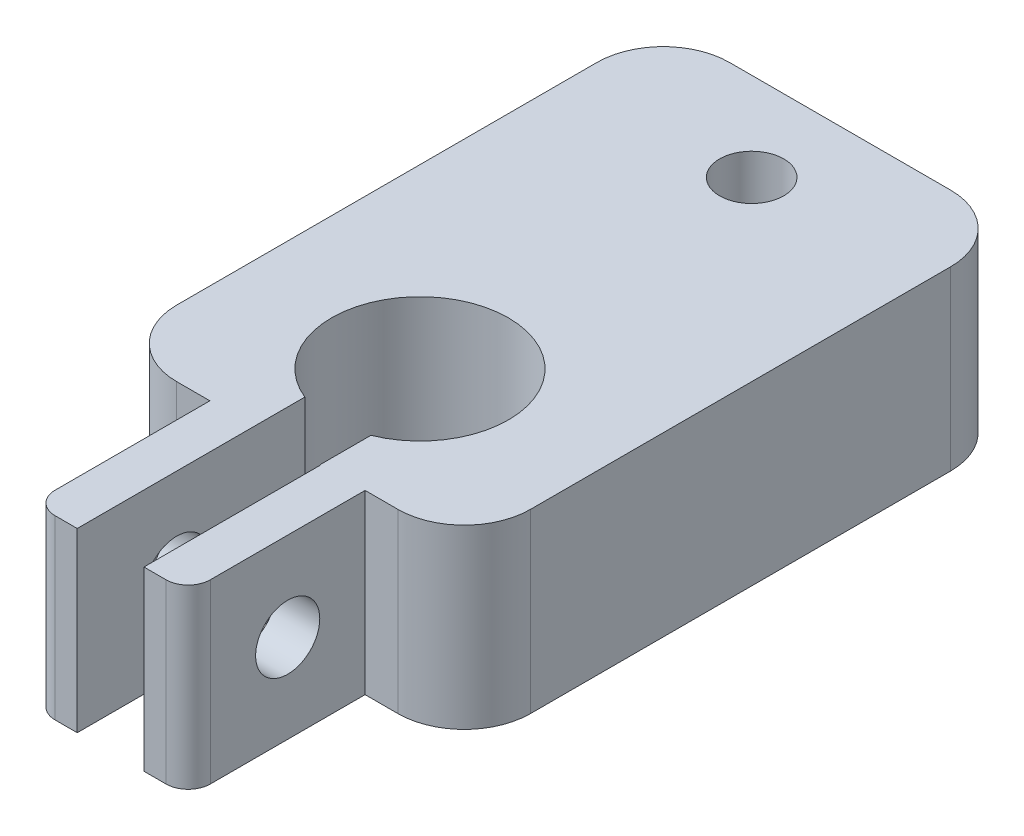
ISO-10303-21;
HEADER;
FILE_DESCRIPTION(('STEP AP214'),'2;1');
FILE_NAME('part.step','',(''),(''),'','','');
FILE_SCHEMA(('AUTOMOTIVE_DESIGN { 1 0 10303 214 1 1 1 1 }'));
ENDSEC;
DATA;
#1=APPLICATION_CONTEXT('core data for automotive mechanical design processes');
#2=APPLICATION_PROTOCOL_DEFINITION('international standard','automotive_design',2000,#1);
#3=PRODUCT_CONTEXT('',#1,'mechanical');
#4=PRODUCT('Part','Part','',(#3));
#5=PRODUCT_RELATED_PRODUCT_CATEGORY('part','',(#4));
#6=PRODUCT_DEFINITION_FORMATION('','',#4);
#7=PRODUCT_DEFINITION_CONTEXT('part definition',#1,'design');
#8=PRODUCT_DEFINITION('design','',#6,#7);
#9=PRODUCT_DEFINITION_SHAPE('','',#8);
#10=(LENGTH_UNIT() NAMED_UNIT(*) SI_UNIT(.MILLI.,.METRE.));
#11=(NAMED_UNIT(*) PLANE_ANGLE_UNIT() SI_UNIT($,.RADIAN.));
#12=(NAMED_UNIT(*) SI_UNIT($,.STERADIAN.) SOLID_ANGLE_UNIT());
#13=UNCERTAINTY_MEASURE_WITH_UNIT(LENGTH_MEASURE(1.E-05),#10,'distance_accuracy_value','');
#14=(GEOMETRIC_REPRESENTATION_CONTEXT(3) GLOBAL_UNCERTAINTY_ASSIGNED_CONTEXT((#13)) GLOBAL_UNIT_ASSIGNED_CONTEXT((#10,
#11,#12)) REPRESENTATION_CONTEXT('',''));
#15=CARTESIAN_POINT('',(0.,0.,0.));
#16=DIRECTION('',(0.,0.,1.));
#17=DIRECTION('',(1.,0.,0.));
#18=AXIS2_PLACEMENT_3D('',#15,#16,#17);
#19=CARTESIAN_POINT('',(0.,8.,0.));
#20=DIRECTION('',(0.,0.,-1.));
#21=DIRECTION('',(-1.,0.,0.));
#22=AXIS2_PLACEMENT_3D('',#19,#20,#21);
#23=PLANE('',#22);
#24=DIRECTION('',(1.,0.,0.));
#25=VECTOR('',#24,1.);
#26=CARTESIAN_POINT('',(0.,8.,0.));
#27=LINE('',#26,#25);
#28=CARTESIAN_POINT('',(9.49362775564579,8.,0.));
#29=VERTEX_POINT('',#28);
#30=CARTESIAN_POINT('',(9.51830255498302,8.,0.));
#31=VERTEX_POINT('',#30);
#32=EDGE_CURVE('E220',#29,#31,#27,.T.);
#33=ORIENTED_EDGE('',*,*,#32,.F.);
#34=DIRECTION('',(0.,-1.,0.));
#35=VECTOR('',#34,1.);
#36=CARTESIAN_POINT('',(9.49362775564579,8.,0.));
#37=LINE('',#36,#35);
#38=CARTESIAN_POINT('',(9.49362775564579,0.,0.));
#39=VERTEX_POINT('',#38);
#40=EDGE_CURVE('E182',#29,#39,#37,.T.);
#41=ORIENTED_EDGE('',*,*,#40,.T.);
#42=DIRECTION('',(1.,0.,0.));
#43=VECTOR('',#42,1.);
#44=CARTESIAN_POINT('',(0.,0.,0.));
#45=LINE('',#44,#43);
#46=CARTESIAN_POINT('',(9.51830255498302,0.,0.));
#47=VERTEX_POINT('',#46);
#48=EDGE_CURVE('E192',#39,#47,#45,.T.);
#49=ORIENTED_EDGE('',*,*,#48,.T.);
#50=DIRECTION('',(0.,1.,0.));
#51=VECTOR('',#50,1.);
#52=CARTESIAN_POINT('',(9.51830255498302,0.,0.));
#53=LINE('',#52,#51);
#54=EDGE_CURVE('E196',#47,#31,#53,.T.);
#55=ORIENTED_EDGE('',*,*,#54,.T.);
#56=EDGE_LOOP('',(#33,#41,#49,#55));
#57=FACE_BOUND('',#56,.T.);
#58=ADVANCED_FACE('F37',(#57),#23,.F.);
#59=CARTESIAN_POINT('',(3.,0.,0.));
#60=VERTEX_POINT('',#59);
#61=CARTESIAN_POINT('',(4.5,0.,0.));
#62=VERTEX_POINT('',#61);
#63=EDGE_CURVE('E230',#60,#62,#45,.T.);
#64=ORIENTED_EDGE('',*,*,#63,.T.);
#65=DIRECTION('',(0.,1.,0.));
#66=VECTOR('',#65,1.);
#67=CARTESIAN_POINT('',(4.5,0.,0.));
#68=LINE('',#67,#66);
#69=CARTESIAN_POINT('',(4.5,8.,0.));
#70=VERTEX_POINT('',#69);
#71=EDGE_CURVE('E330',#62,#70,#68,.T.);
#72=ORIENTED_EDGE('',*,*,#71,.T.);
#73=CARTESIAN_POINT('',(3.,8.,0.));
#74=VERTEX_POINT('',#73);
#75=EDGE_CURVE('E216',#74,#70,#27,.T.);
#76=ORIENTED_EDGE('',*,*,#75,.F.);
#77=DIRECTION('',(0.,-1.,0.));
#78=VECTOR('',#77,1.);
#79=CARTESIAN_POINT('',(3.,8.,0.));
#80=LINE('',#79,#78);
#81=EDGE_CURVE('E268',#74,#60,#80,.T.);
#82=ORIENTED_EDGE('',*,*,#81,.T.);
#83=EDGE_LOOP('',(#64,#72,#76,#82));
#84=FACE_BOUND('',#83,.T.);
#85=ADVANCED_FACE('F423',(#84),#23,.F.);
#86=CARTESIAN_POINT('',(0.,8.,0.));
#87=DIRECTION('',(0.,-1.,0.));
#88=DIRECTION('',(0.,0.,-1.));
#89=AXIS2_PLACEMENT_3D('',#86,#87,#88);
#90=PLANE('',#89);
#91=CARTESIAN_POINT('',(8.,8.,-6.));
#92=DIRECTION('',(0.,1.,0.));
#93=DIRECTION('',(0.,0.,1.));
#94=AXIS2_PLACEMENT_3D('',#91,#92,#93);
#95=CIRCLE('',#94,4.);
#96=CARTESIAN_POINT('',(9.49362775564579,8.,-2.28932942346474));
#97=VERTEX_POINT('',#96);
#98=CARTESIAN_POINT('',(6.5,8.,-2.29190075645217));
#99=VERTEX_POINT('',#98);
#100=EDGE_CURVE('E195',#97,#99,#95,.T.);
#101=ORIENTED_EDGE('',*,*,#100,.F.);
#102=DIRECTION('',(0.,0.,-1.));
#103=VECTOR('',#102,1.);
#104=CARTESIAN_POINT('',(9.49362775564579,8.,1.76134076037922));
#105=LINE('',#104,#103);
#106=EDGE_CURVE('E61',#29,#97,#105,.T.);
#107=ORIENTED_EDGE('',*,*,#106,.F.);
#108=ORIENTED_EDGE('',*,*,#32,.T.);
#109=DIRECTION('',(0.,0.,1.));
#110=VECTOR('',#109,1.);
#111=CARTESIAN_POINT('',(9.51830255498302,8.,0.));
#112=LINE('',#111,#110);
#113=CARTESIAN_POINT('',(9.51830255498302,8.,8.));
#114=VERTEX_POINT('',#113);
#115=EDGE_CURVE('E316',#31,#114,#112,.T.);
#116=ORIENTED_EDGE('',*,*,#115,.T.);
#117=DIRECTION('',(1.,0.,0.));
#118=VECTOR('',#117,1.);
#119=CARTESIAN_POINT('',(9.51830255498302,8.,8.));
#120=LINE('',#119,#118);
#121=CARTESIAN_POINT('',(10.518302554983,8.,8.));
#122=VERTEX_POINT('',#121);
#123=EDGE_CURVE('E310',#114,#122,#120,.T.);
#124=ORIENTED_EDGE('',*,*,#123,.T.);
#125=CARTESIAN_POINT('',(10.518302554983,8.,7.));
#126=DIRECTION('',(0.,-1.,0.));
#127=DIRECTION('',(0.,0.,-1.));
#128=AXIS2_PLACEMENT_3D('',#125,#126,#127);
#129=CIRCLE('',#128,1.);
#130=CARTESIAN_POINT('',(11.518302554983,8.,7.));
#131=VERTEX_POINT('',#130);
#132=EDGE_CURVE('E286',#122,#131,#129,.F.);
#133=ORIENTED_EDGE('',*,*,#132,.T.);
#134=DIRECTION('',(0.,0.,-1.));
#135=VECTOR('',#134,1.);
#136=CARTESIAN_POINT('',(11.518302554983,8.,0.));
#137=LINE('',#136,#135);
#138=CARTESIAN_POINT('',(11.518302554983,8.,0.));
#139=VERTEX_POINT('',#138);
#140=EDGE_CURVE('E296',#131,#139,#137,.T.);
#141=ORIENTED_EDGE('',*,*,#140,.T.);
#142=CARTESIAN_POINT('',(13.,8.,0.));
#143=VERTEX_POINT('',#142);
#144=EDGE_CURVE('E214',#139,#143,#27,.T.);
#145=ORIENTED_EDGE('',*,*,#144,.T.);
#146=CARTESIAN_POINT('',(13.,8.,-3.));
#147=DIRECTION('',(0.,-1.,0.));
#148=DIRECTION('',(0.,0.,-1.));
#149=AXIS2_PLACEMENT_3D('',#146,#147,#148);
#150=CIRCLE('',#149,3.);
#151=CARTESIAN_POINT('',(16.,8.,-3.));
#152=VERTEX_POINT('',#151);
#153=EDGE_CURVE('E257',#143,#152,#150,.F.);
#154=ORIENTED_EDGE('',*,*,#153,.T.);
#155=DIRECTION('',(0.,0.,-1.));
#156=VECTOR('',#155,1.);
#157=CARTESIAN_POINT('',(16.,8.,0.));
#158=LINE('',#157,#156);
#159=CARTESIAN_POINT('',(16.,8.,-22.));
#160=VERTEX_POINT('',#159);
#161=EDGE_CURVE('E219',#152,#160,#158,.T.);
#162=ORIENTED_EDGE('',*,*,#161,.T.);
#163=CARTESIAN_POINT('',(13.,8.,-22.));
#164=DIRECTION('',(0.,-1.,0.));
#165=DIRECTION('',(0.,0.,-1.));
#166=AXIS2_PLACEMENT_3D('',#163,#164,#165);
#167=CIRCLE('',#166,3.);
#168=CARTESIAN_POINT('',(13.,8.,-25.));
#169=VERTEX_POINT('',#168);
#170=EDGE_CURVE('E261',#160,#169,#167,.F.);
#171=ORIENTED_EDGE('',*,*,#170,.T.);
#172=DIRECTION('',(-1.,0.,0.));
#173=VECTOR('',#172,1.);
#174=CARTESIAN_POINT('',(0.,8.,-25.));
#175=LINE('',#174,#173);
#176=CARTESIAN_POINT('',(3.,8.,-25.));
#177=VERTEX_POINT('',#176);
#178=EDGE_CURVE('E223',#169,#177,#175,.T.);
#179=ORIENTED_EDGE('',*,*,#178,.T.);
#180=CARTESIAN_POINT('',(3.,8.,-22.));
#181=DIRECTION('',(0.,-1.,0.));
#182=DIRECTION('',(0.,0.,-1.));
#183=AXIS2_PLACEMENT_3D('',#180,#181,#182);
#184=CIRCLE('',#183,3.);
#185=CARTESIAN_POINT('',(0.,8.,-22.));
#186=VERTEX_POINT('',#185);
#187=EDGE_CURVE('E259',#177,#186,#184,.F.);
#188=ORIENTED_EDGE('',*,*,#187,.T.);
#189=DIRECTION('',(0.,0.,1.));
#190=VECTOR('',#189,1.);
#191=CARTESIAN_POINT('',(0.,8.,0.));
#192=LINE('',#191,#190);
#193=CARTESIAN_POINT('',(0.,8.,-3.));
#194=VERTEX_POINT('',#193);
#195=EDGE_CURVE('E211',#186,#194,#192,.T.);
#196=ORIENTED_EDGE('',*,*,#195,.T.);
#197=CARTESIAN_POINT('',(3.,8.,-3.));
#198=DIRECTION('',(0.,-1.,0.));
#199=DIRECTION('',(0.,0.,-1.));
#200=AXIS2_PLACEMENT_3D('',#197,#198,#199);
#201=CIRCLE('',#200,3.);
#202=EDGE_CURVE('E255',#194,#74,#201,.F.);
#203=ORIENTED_EDGE('',*,*,#202,.T.);
#204=ORIENTED_EDGE('',*,*,#75,.T.);
#205=DIRECTION('',(0.,0.,1.));
#206=VECTOR('',#205,1.);
#207=CARTESIAN_POINT('',(4.5,8.,0.));
#208=LINE('',#207,#206);
#209=CARTESIAN_POINT('',(4.5,8.,7.));
#210=VERTEX_POINT('',#209);
#211=EDGE_CURVE('E337',#70,#210,#208,.T.);
#212=ORIENTED_EDGE('',*,*,#211,.T.);
#213=CARTESIAN_POINT('',(5.5,8.,7.));
#214=DIRECTION('',(0.,-1.,0.));
#215=DIRECTION('',(0.,0.,-1.));
#216=AXIS2_PLACEMENT_3D('',#213,#214,#215);
#217=CIRCLE('',#216,1.);
#218=CARTESIAN_POINT('',(5.5,8.,8.));
#219=VERTEX_POINT('',#218);
#220=EDGE_CURVE('E277',#210,#219,#217,.F.);
#221=ORIENTED_EDGE('',*,*,#220,.T.);
#222=DIRECTION('',(1.,0.,0.));
#223=VECTOR('',#222,1.);
#224=CARTESIAN_POINT('',(6.5,8.,8.));
#225=LINE('',#224,#223);
#226=CARTESIAN_POINT('',(6.5,8.,8.));
#227=VERTEX_POINT('',#226);
#228=EDGE_CURVE('E335',#219,#227,#225,.T.);
#229=ORIENTED_EDGE('',*,*,#228,.T.);
#230=DIRECTION('',(0.,0.,-1.));
#231=VECTOR('',#230,1.);
#232=CARTESIAN_POINT('',(6.5,8.,0.));
#233=LINE('',#232,#231);
#234=EDGE_CURVE('E340',#227,#99,#233,.T.);
#235=ORIENTED_EDGE('',*,*,#234,.T.);
#236=EDGE_LOOP('',(#101,#107,#108,#116,#124,#133,#141,#145,#154,#162,#171,#179,#188,#196,#203,
#204,#212,#221,#229,#235));
#237=FACE_BOUND('',#236,.T.);
#238=CARTESIAN_POINT('',(8.,8.,-21.));
#239=DIRECTION('',(0.,1.,0.));
#240=DIRECTION('',(0.,0.,1.));
#241=AXIS2_PLACEMENT_3D('',#238,#239,#240);
#242=CIRCLE('',#241,1.45);
#243=CARTESIAN_POINT('',(8.,8.,-19.55));
#244=VERTEX_POINT('',#243);
#245=EDGE_CURVE('E205',#244,#244,#242,.T.);
#246=ORIENTED_EDGE('',*,*,#245,.F.);
#247=EDGE_LOOP('',(#246));
#248=FACE_BOUND('',#247,.T.);
#249=ADVANCED_FACE('F313',(#237,#248),#90,.F.);
#250=CARTESIAN_POINT('',(0.,0.,0.));
#251=DIRECTION('',(0.,-1.,0.));
#252=DIRECTION('',(0.,0.,-1.));
#253=AXIS2_PLACEMENT_3D('',#250,#251,#252);
#254=PLANE('',#253);
#255=DIRECTION('',(0.,0.,-1.));
#256=VECTOR('',#255,1.);
#257=CARTESIAN_POINT('',(9.49362775564579,0.,1.76134076037922));
#258=LINE('',#257,#256);
#259=CARTESIAN_POINT('',(9.49362775564579,0.,-2.28932942346474));
#260=VERTEX_POINT('',#259);
#261=EDGE_CURVE('E176',#39,#260,#258,.T.);
#262=ORIENTED_EDGE('',*,*,#261,.T.);
#263=CARTESIAN_POINT('',(8.,0.,-6.));
#264=DIRECTION('',(0.,1.,0.));
#265=DIRECTION('',(0.,0.,1.));
#266=AXIS2_PLACEMENT_3D('',#263,#264,#265);
#267=CIRCLE('',#266,4.);
#268=CARTESIAN_POINT('',(6.5,0.,-2.29190075645217));
#269=VERTEX_POINT('',#268);
#270=EDGE_CURVE('E190',#260,#269,#267,.T.);
#271=ORIENTED_EDGE('',*,*,#270,.T.);
#272=DIRECTION('',(0.,0.,-1.));
#273=VECTOR('',#272,1.);
#274=CARTESIAN_POINT('',(6.5,0.,0.));
#275=LINE('',#274,#273);
#276=CARTESIAN_POINT('',(6.5,0.,8.));
#277=VERTEX_POINT('',#276);
#278=EDGE_CURVE('E53',#277,#269,#275,.T.);
#279=ORIENTED_EDGE('',*,*,#278,.F.);
#280=DIRECTION('',(1.,0.,0.));
#281=VECTOR('',#280,1.);
#282=CARTESIAN_POINT('',(6.5,0.,8.));
#283=LINE('',#282,#281);
#284=CARTESIAN_POINT('',(5.5,0.,8.));
#285=VERTEX_POINT('',#284);
#286=EDGE_CURVE('E332',#285,#277,#283,.T.);
#287=ORIENTED_EDGE('',*,*,#286,.F.);
#288=CARTESIAN_POINT('',(5.5,0.,7.));
#289=DIRECTION('',(0.,-1.,0.));
#290=DIRECTION('',(0.,0.,-1.));
#291=AXIS2_PLACEMENT_3D('',#288,#289,#290);
#292=CIRCLE('',#291,1.);
#293=CARTESIAN_POINT('',(4.5,0.,7.));
#294=VERTEX_POINT('',#293);
#295=EDGE_CURVE('E281',#285,#294,#292,.T.);
#296=ORIENTED_EDGE('',*,*,#295,.T.);
#297=DIRECTION('',(0.,0.,1.));
#298=VECTOR('',#297,1.);
#299=CARTESIAN_POINT('',(4.5,0.,0.));
#300=LINE('',#299,#298);
#301=EDGE_CURVE('E343',#62,#294,#300,.T.);
#302=ORIENTED_EDGE('',*,*,#301,.F.);
#303=ORIENTED_EDGE('',*,*,#63,.F.);
#304=CARTESIAN_POINT('',(3.,0.,-3.));
#305=DIRECTION('',(0.,-1.,0.));
#306=DIRECTION('',(0.,0.,-1.));
#307=AXIS2_PLACEMENT_3D('',#304,#305,#306);
#308=CIRCLE('',#307,3.);
#309=CARTESIAN_POINT('',(0.,0.,-3.));
#310=VERTEX_POINT('',#309);
#311=EDGE_CURVE('E241',#60,#310,#308,.T.);
#312=ORIENTED_EDGE('',*,*,#311,.T.);
#313=DIRECTION('',(0.,0.,1.));
#314=VECTOR('',#313,1.);
#315=CARTESIAN_POINT('',(0.,0.,0.));
#316=LINE('',#315,#314);
#317=CARTESIAN_POINT('',(0.,0.,-22.));
#318=VERTEX_POINT('',#317);
#319=EDGE_CURVE('E208',#318,#310,#316,.T.);
#320=ORIENTED_EDGE('',*,*,#319,.F.);
#321=CARTESIAN_POINT('',(3.,0.,-22.));
#322=DIRECTION('',(0.,-1.,0.));
#323=DIRECTION('',(0.,0.,-1.));
#324=AXIS2_PLACEMENT_3D('',#321,#322,#323);
#325=CIRCLE('',#324,3.);
#326=CARTESIAN_POINT('',(3.,0.,-25.));
#327=VERTEX_POINT('',#326);
#328=EDGE_CURVE('E246',#318,#327,#325,.T.);
#329=ORIENTED_EDGE('',*,*,#328,.T.);
#330=DIRECTION('',(-1.,0.,0.));
#331=VECTOR('',#330,1.);
#332=CARTESIAN_POINT('',(0.,0.,-25.));
#333=LINE('',#332,#331);
#334=CARTESIAN_POINT('',(13.,0.,-25.));
#335=VERTEX_POINT('',#334);
#336=EDGE_CURVE('E215',#335,#327,#333,.T.);
#337=ORIENTED_EDGE('',*,*,#336,.F.);
#338=CARTESIAN_POINT('',(13.,0.,-22.));
#339=DIRECTION('',(0.,-1.,0.));
#340=DIRECTION('',(0.,0.,-1.));
#341=AXIS2_PLACEMENT_3D('',#338,#339,#340);
#342=CIRCLE('',#341,3.);
#343=CARTESIAN_POINT('',(16.,0.,-22.));
#344=VERTEX_POINT('',#343);
#345=EDGE_CURVE('E248',#335,#344,#342,.T.);
#346=ORIENTED_EDGE('',*,*,#345,.T.);
#347=DIRECTION('',(0.,0.,-1.));
#348=VECTOR('',#347,1.);
#349=CARTESIAN_POINT('',(16.,0.,0.));
#350=LINE('',#349,#348);
#351=CARTESIAN_POINT('',(16.,0.,-3.));
#352=VERTEX_POINT('',#351);
#353=EDGE_CURVE('E232',#352,#344,#350,.T.);
#354=ORIENTED_EDGE('',*,*,#353,.F.);
#355=CARTESIAN_POINT('',(13.,0.,-3.));
#356=DIRECTION('',(0.,-1.,0.));
#357=DIRECTION('',(0.,0.,-1.));
#358=AXIS2_PLACEMENT_3D('',#355,#356,#357);
#359=CIRCLE('',#358,3.);
#360=CARTESIAN_POINT('',(13.,0.,0.));
#361=VERTEX_POINT('',#360);
#362=EDGE_CURVE('E243',#352,#361,#359,.T.);
#363=ORIENTED_EDGE('',*,*,#362,.T.);
#364=CARTESIAN_POINT('',(11.518302554983,0.,0.));
#365=VERTEX_POINT('',#364);
#366=EDGE_CURVE('E229',#365,#361,#45,.T.);
#367=ORIENTED_EDGE('',*,*,#366,.F.);
#368=DIRECTION('',(0.,0.,-1.));
#369=VECTOR('',#368,1.);
#370=CARTESIAN_POINT('',(11.518302554983,0.,0.));
#371=LINE('',#370,#369);
#372=CARTESIAN_POINT('',(11.518302554983,0.,7.));
#373=VERTEX_POINT('',#372);
#374=EDGE_CURVE('E294',#373,#365,#371,.T.);
#375=ORIENTED_EDGE('',*,*,#374,.F.);
#376=CARTESIAN_POINT('',(10.518302554983,0.,7.));
#377=DIRECTION('',(0.,-1.,0.));
#378=DIRECTION('',(0.,0.,-1.));
#379=AXIS2_PLACEMENT_3D('',#376,#377,#378);
#380=CIRCLE('',#379,1.);
#381=CARTESIAN_POINT('',(10.518302554983,0.,8.));
#382=VERTEX_POINT('',#381);
#383=EDGE_CURVE('E11',#373,#382,#380,.T.);
#384=ORIENTED_EDGE('',*,*,#383,.T.);
#385=DIRECTION('',(1.,0.,0.));
#386=VECTOR('',#385,1.);
#387=CARTESIAN_POINT('',(9.51830255498302,0.,8.));
#388=LINE('',#387,#386);
#389=CARTESIAN_POINT('',(9.51830255498302,0.,8.));
#390=VERTEX_POINT('',#389);
#391=EDGE_CURVE('E303',#390,#382,#388,.T.);
#392=ORIENTED_EDGE('',*,*,#391,.F.);
#393=DIRECTION('',(0.,0.,1.));
#394=VECTOR('',#393,1.);
#395=CARTESIAN_POINT('',(9.51830255498302,0.,0.));
#396=LINE('',#395,#394);
#397=EDGE_CURVE('E318',#47,#390,#396,.T.);
#398=ORIENTED_EDGE('',*,*,#397,.F.);
#399=ORIENTED_EDGE('',*,*,#48,.F.);
#400=EDGE_LOOP('',(#262,#271,#279,#287,#296,#302,#303,#312,#320,#329,#337,#346,#354,#363,#367,
#375,#384,#392,#398,#399));
#401=FACE_BOUND('',#400,.T.);
#402=CARTESIAN_POINT('',(8.,0.,-21.));
#403=DIRECTION('',(0.,1.,0.));
#404=DIRECTION('',(0.,0.,1.));
#405=AXIS2_PLACEMENT_3D('',#402,#403,#404);
#406=CIRCLE('',#405,1.45);
#407=CARTESIAN_POINT('',(8.,0.,-19.55));
#408=VERTEX_POINT('',#407);
#409=EDGE_CURVE('E198',#408,#408,#406,.T.);
#410=ORIENTED_EDGE('',*,*,#409,.T.);
#411=EDGE_LOOP('',(#410));
#412=FACE_BOUND('',#411,.T.);
#413=ADVANCED_FACE('F188',(#401,#412),#254,.T.);
#414=CARTESIAN_POINT('',(0.,8.,0.));
#415=DIRECTION('',(1.,0.,0.));
#416=DIRECTION('',(0.,0.,-1.));
#417=AXIS2_PLACEMENT_3D('',#414,#415,#416);
#418=PLANE('',#417);
#419=ORIENTED_EDGE('',*,*,#195,.F.);
#420=DIRECTION('',(0.,-1.,0.));
#421=VECTOR('',#420,1.);
#422=CARTESIAN_POINT('',(0.,8.,-22.));
#423=LINE('',#422,#421);
#424=EDGE_CURVE('E265',#186,#318,#423,.T.);
#425=ORIENTED_EDGE('',*,*,#424,.T.);
#426=ORIENTED_EDGE('',*,*,#319,.T.);
#427=DIRECTION('',(0.,-1.,0.));
#428=VECTOR('',#427,1.);
#429=CARTESIAN_POINT('',(0.,8.,-3.));
#430=LINE('',#429,#428);
#431=EDGE_CURVE('E263',#310,#194,#430,.F.);
#432=ORIENTED_EDGE('',*,*,#431,.T.);
#433=EDGE_LOOP('',(#419,#425,#426,#432));
#434=FACE_BOUND('',#433,.T.);
#435=ADVANCED_FACE('F415',(#434),#418,.F.);
#436=ORIENTED_EDGE('',*,*,#144,.F.);
#437=DIRECTION('',(0.,1.,0.));
#438=VECTOR('',#437,1.);
#439=CARTESIAN_POINT('',(11.518302554983,0.,0.));
#440=LINE('',#439,#438);
#441=EDGE_CURVE('E201',#365,#139,#440,.T.);
#442=ORIENTED_EDGE('',*,*,#441,.F.);
#443=ORIENTED_EDGE('',*,*,#366,.T.);
#444=DIRECTION('',(0.,-1.,0.));
#445=VECTOR('',#444,1.);
#446=CARTESIAN_POINT('',(13.,8.,0.));
#447=LINE('',#446,#445);
#448=EDGE_CURVE('E271',#361,#143,#447,.F.);
#449=ORIENTED_EDGE('',*,*,#448,.T.);
#450=EDGE_LOOP('',(#436,#442,#443,#449));
#451=FACE_BOUND('',#450,.T.);
#452=ADVANCED_FACE('F391',(#451),#23,.F.);
#453=CARTESIAN_POINT('',(16.,8.,0.));
#454=DIRECTION('',(-1.,0.,0.));
#455=DIRECTION('',(0.,0.,1.));
#456=AXIS2_PLACEMENT_3D('',#453,#454,#455);
#457=PLANE('',#456);
#458=ORIENTED_EDGE('',*,*,#353,.T.);
#459=DIRECTION('',(0.,-1.,0.));
#460=VECTOR('',#459,1.);
#461=CARTESIAN_POINT('',(16.,8.,-22.));
#462=LINE('',#461,#460);
#463=EDGE_CURVE('E253',#344,#160,#462,.F.);
#464=ORIENTED_EDGE('',*,*,#463,.T.);
#465=ORIENTED_EDGE('',*,*,#161,.F.);
#466=DIRECTION('',(0.,-1.,0.));
#467=VECTOR('',#466,1.);
#468=CARTESIAN_POINT('',(16.,8.,-3.));
#469=LINE('',#468,#467);
#470=EDGE_CURVE('E250',#152,#352,#469,.T.);
#471=ORIENTED_EDGE('',*,*,#470,.T.);
#472=EDGE_LOOP('',(#458,#464,#465,#471));
#473=FACE_BOUND('',#472,.T.);
#474=ADVANCED_FACE('F397',(#473),#457,.F.);
#475=CARTESIAN_POINT('',(0.,8.,-25.));
#476=DIRECTION('',(0.,0.,1.));
#477=DIRECTION('',(1.,0.,0.));
#478=AXIS2_PLACEMENT_3D('',#475,#476,#477);
#479=PLANE('',#478);
#480=ORIENTED_EDGE('',*,*,#178,.F.);
#481=DIRECTION('',(0.,-1.,0.));
#482=VECTOR('',#481,1.);
#483=CARTESIAN_POINT('',(13.,8.,-25.));
#484=LINE('',#483,#482);
#485=EDGE_CURVE('E238',#169,#335,#484,.T.);
#486=ORIENTED_EDGE('',*,*,#485,.T.);
#487=ORIENTED_EDGE('',*,*,#336,.T.);
#488=DIRECTION('',(0.,-1.,0.));
#489=VECTOR('',#488,1.);
#490=CARTESIAN_POINT('',(3.,8.,-25.));
#491=LINE('',#490,#489);
#492=EDGE_CURVE('E226',#327,#177,#491,.F.);
#493=ORIENTED_EDGE('',*,*,#492,.T.);
#494=EDGE_LOOP('',(#480,#486,#487,#493));
#495=FACE_BOUND('',#494,.T.);
#496=ADVANCED_FACE('F406',(#495),#479,.F.);
#497=CARTESIAN_POINT('',(8.,8.,-21.));
#498=DIRECTION('',(0.,-1.,0.));
#499=DIRECTION('',(0.,0.,-1.));
#500=AXIS2_PLACEMENT_3D('',#497,#498,#499);
#501=CYLINDRICAL_SURFACE('',#500,1.45);
#502=ORIENTED_EDGE('',*,*,#245,.T.);
#503=EDGE_LOOP('',(#502));
#504=FACE_BOUND('',#503,.T.);
#505=ORIENTED_EDGE('',*,*,#409,.F.);
#506=EDGE_LOOP('',(#505));
#507=FACE_BOUND('',#506,.T.);
#508=ADVANCED_FACE('F480',(#504,#507),#501,.F.);
#509=CARTESIAN_POINT('',(8.,8.,-6.));
#510=DIRECTION('',(0.,-1.,0.));
#511=DIRECTION('',(0.,0.,-1.));
#512=AXIS2_PLACEMENT_3D('',#509,#510,#511);
#513=CYLINDRICAL_SURFACE('',#512,4.);
#514=DIRECTION('',(0.,1.,0.));
#515=VECTOR('',#514,1.);
#516=CARTESIAN_POINT('',(9.49362775564579,0.,-2.28932942346474));
#517=LINE('',#516,#515);
#518=EDGE_CURVE('E173',#260,#97,#517,.T.);
#519=ORIENTED_EDGE('',*,*,#518,.T.);
#520=ORIENTED_EDGE('',*,*,#100,.T.);
#521=DIRECTION('',(0.,1.,0.));
#522=VECTOR('',#521,1.);
#523=CARTESIAN_POINT('',(6.5,0.,-2.29190075645217));
#524=LINE('',#523,#522);
#525=EDGE_CURVE('E183',#269,#99,#524,.T.);
#526=ORIENTED_EDGE('',*,*,#525,.F.);
#527=ORIENTED_EDGE('',*,*,#270,.F.);
#528=EDGE_LOOP('',(#519,#520,#526,#527));
#529=FACE_BOUND('',#528,.T.);
#530=ADVANCED_FACE('F194',(#529),#513,.F.);
#531=CARTESIAN_POINT('',(13.,8.,-22.));
#532=DIRECTION('',(0.,-1.,0.));
#533=DIRECTION('',(0.,0.,-1.));
#534=AXIS2_PLACEMENT_3D('',#531,#532,#533);
#535=CYLINDRICAL_SURFACE('',#534,3.);
#536=ORIENTED_EDGE('',*,*,#170,.F.);
#537=ORIENTED_EDGE('',*,*,#463,.F.);
#538=ORIENTED_EDGE('',*,*,#345,.F.);
#539=ORIENTED_EDGE('',*,*,#485,.F.);
#540=EDGE_LOOP('',(#536,#537,#538,#539));
#541=FACE_BOUND('',#540,.T.);
#542=ADVANCED_FACE('F403',(#541),#535,.T.);
#543=CARTESIAN_POINT('',(3.,8.,-22.));
#544=DIRECTION('',(0.,-1.,0.));
#545=DIRECTION('',(0.,0.,-1.));
#546=AXIS2_PLACEMENT_3D('',#543,#544,#545);
#547=CYLINDRICAL_SURFACE('',#546,3.);
#548=ORIENTED_EDGE('',*,*,#187,.F.);
#549=ORIENTED_EDGE('',*,*,#492,.F.);
#550=ORIENTED_EDGE('',*,*,#328,.F.);
#551=ORIENTED_EDGE('',*,*,#424,.F.);
#552=EDGE_LOOP('',(#548,#549,#550,#551));
#553=FACE_BOUND('',#552,.T.);
#554=ADVANCED_FACE('F412',(#553),#547,.T.);
#555=CARTESIAN_POINT('',(13.,8.,-3.));
#556=DIRECTION('',(0.,-1.,0.));
#557=DIRECTION('',(0.,0.,-1.));
#558=AXIS2_PLACEMENT_3D('',#555,#556,#557);
#559=CYLINDRICAL_SURFACE('',#558,3.);
#560=ORIENTED_EDGE('',*,*,#153,.F.);
#561=ORIENTED_EDGE('',*,*,#448,.F.);
#562=ORIENTED_EDGE('',*,*,#362,.F.);
#563=ORIENTED_EDGE('',*,*,#470,.F.);
#564=EDGE_LOOP('',(#560,#561,#562,#563));
#565=FACE_BOUND('',#564,.T.);
#566=ADVANCED_FACE('F394',(#565),#559,.T.);
#567=CARTESIAN_POINT('',(3.,8.,-3.));
#568=DIRECTION('',(0.,-1.,0.));
#569=DIRECTION('',(0.,0.,-1.));
#570=AXIS2_PLACEMENT_3D('',#567,#568,#569);
#571=CYLINDRICAL_SURFACE('',#570,3.);
#572=ORIENTED_EDGE('',*,*,#202,.F.);
#573=ORIENTED_EDGE('',*,*,#431,.F.);
#574=ORIENTED_EDGE('',*,*,#311,.F.);
#575=ORIENTED_EDGE('',*,*,#81,.F.);
#576=EDGE_LOOP('',(#572,#573,#574,#575));
#577=FACE_BOUND('',#576,.T.);
#578=ADVANCED_FACE('F420',(#577),#571,.T.);
#579=CARTESIAN_POINT('',(9.51830255498302,0.,0.));
#580=DIRECTION('',(-1.,0.,0.));
#581=DIRECTION('',(0.,0.,1.));
#582=AXIS2_PLACEMENT_3D('',#579,#580,#581);
#583=PLANE('',#582);
#584=CARTESIAN_POINT('',(9.51830255498302,4.,3.5));
#585=DIRECTION('',(-1.,0.,0.));
#586=DIRECTION('',(0.,0.,1.));
#587=AXIS2_PLACEMENT_3D('',#584,#585,#586);
#588=CIRCLE('',#587,1.45);
#589=CARTESIAN_POINT('',(9.51830255498302,4.,4.95));
#590=VERTEX_POINT('',#589);
#591=EDGE_CURVE('E349',#590,#590,#588,.T.);
#592=ORIENTED_EDGE('',*,*,#591,.F.);
#593=EDGE_LOOP('',(#592));
#594=FACE_BOUND('',#593,.T.);
#595=ORIENTED_EDGE('',*,*,#115,.F.);
#596=ORIENTED_EDGE('',*,*,#54,.F.);
#597=ORIENTED_EDGE('',*,*,#397,.T.);
#598=DIRECTION('',(0.,1.,0.));
#599=VECTOR('',#598,1.);
#600=CARTESIAN_POINT('',(9.51830255498302,0.,8.));
#601=LINE('',#600,#599);
#602=EDGE_CURVE('E302',#390,#114,#601,.T.);
#603=ORIENTED_EDGE('',*,*,#602,.T.);
#604=EDGE_LOOP('',(#595,#596,#597,#603));
#605=FACE_BOUND('',#604,.T.);
#606=ADVANCED_FACE('F325',(#594,#605),#583,.T.);
#607=CARTESIAN_POINT('',(11.518302554983,0.,0.));
#608=DIRECTION('',(1.,0.,0.));
#609=DIRECTION('',(0.,0.,-1.));
#610=AXIS2_PLACEMENT_3D('',#607,#608,#609);
#611=PLANE('',#610);
#612=CARTESIAN_POINT('',(11.518302554983,4.,3.5));
#613=DIRECTION('',(1.,0.,0.));
#614=DIRECTION('',(0.,0.,-1.));
#615=AXIS2_PLACEMENT_3D('',#612,#613,#614);
#616=CIRCLE('',#615,1.45);
#617=CARTESIAN_POINT('',(11.518302554983,4.,2.05));
#618=VERTEX_POINT('',#617);
#619=EDGE_CURVE('E356',#618,#618,#616,.T.);
#620=ORIENTED_EDGE('',*,*,#619,.F.);
#621=EDGE_LOOP('',(#620));
#622=FACE_BOUND('',#621,.T.);
#623=ORIENTED_EDGE('',*,*,#140,.F.);
#624=DIRECTION('',(0.,1.,0.));
#625=VECTOR('',#624,1.);
#626=CARTESIAN_POINT('',(11.518302554983,0.,7.));
#627=LINE('',#626,#625);
#628=EDGE_CURVE('E46',#131,#373,#627,.F.);
#629=ORIENTED_EDGE('',*,*,#628,.T.);
#630=ORIENTED_EDGE('',*,*,#374,.T.);
#631=ORIENTED_EDGE('',*,*,#441,.T.);
#632=EDGE_LOOP('',(#623,#629,#630,#631));
#633=FACE_BOUND('',#632,.T.);
#634=ADVANCED_FACE('F292',(#622,#633),#611,.T.);
#635=CARTESIAN_POINT('',(9.51830255498302,0.,8.));
#636=DIRECTION('',(0.,0.,1.));
#637=DIRECTION('',(1.,0.,0.));
#638=AXIS2_PLACEMENT_3D('',#635,#636,#637);
#639=PLANE('',#638);
#640=ORIENTED_EDGE('',*,*,#391,.T.);
#641=DIRECTION('',(0.,1.,0.));
#642=VECTOR('',#641,1.);
#643=CARTESIAN_POINT('',(10.518302554983,0.,8.));
#644=LINE('',#643,#642);
#645=EDGE_CURVE('E283',#382,#122,#644,.T.);
#646=ORIENTED_EDGE('',*,*,#645,.T.);
#647=ORIENTED_EDGE('',*,*,#123,.F.);
#648=ORIENTED_EDGE('',*,*,#602,.F.);
#649=EDGE_LOOP('',(#640,#646,#647,#648));
#650=FACE_BOUND('',#649,.T.);
#651=ADVANCED_FACE('F309',(#650),#639,.T.);
#652=CARTESIAN_POINT('',(6.5,0.,0.));
#653=DIRECTION('',(1.,0.,0.));
#654=DIRECTION('',(0.,0.,-1.));
#655=AXIS2_PLACEMENT_3D('',#652,#653,#654);
#656=PLANE('',#655);
#657=CARTESIAN_POINT('',(6.5,4.,3.5));
#658=DIRECTION('',(1.,0.,0.));
#659=DIRECTION('',(0.,0.,-1.));
#660=AXIS2_PLACEMENT_3D('',#657,#658,#659);
#661=CIRCLE('',#660,1.45);
#662=CARTESIAN_POINT('',(6.5,4.,2.05));
#663=VERTEX_POINT('',#662);
#664=EDGE_CURVE('E353',#663,#663,#661,.T.);
#665=ORIENTED_EDGE('',*,*,#664,.F.);
#666=EDGE_LOOP('',(#665));
#667=FACE_BOUND('',#666,.T.);
#668=ORIENTED_EDGE('',*,*,#278,.T.);
#669=ORIENTED_EDGE('',*,*,#525,.T.);
#670=ORIENTED_EDGE('',*,*,#234,.F.);
#671=DIRECTION('',(0.,1.,0.));
#672=VECTOR('',#671,1.);
#673=CARTESIAN_POINT('',(6.5,0.,8.));
#674=LINE('',#673,#672);
#675=EDGE_CURVE('E320',#277,#227,#674,.T.);
#676=ORIENTED_EDGE('',*,*,#675,.F.);
#677=EDGE_LOOP('',(#668,#669,#670,#676));
#678=FACE_BOUND('',#677,.T.);
#679=ADVANCED_FACE('F383',(#667,#678),#656,.T.);
#680=CARTESIAN_POINT('',(6.5,0.,8.));
#681=DIRECTION('',(0.,0.,1.));
#682=DIRECTION('',(1.,0.,0.));
#683=AXIS2_PLACEMENT_3D('',#680,#681,#682);
#684=PLANE('',#683);
#685=ORIENTED_EDGE('',*,*,#228,.F.);
#686=DIRECTION('',(0.,1.,0.));
#687=VECTOR('',#686,1.);
#688=CARTESIAN_POINT('',(5.5,0.,8.));
#689=LINE('',#688,#687);
#690=EDGE_CURVE('E279',#219,#285,#689,.F.);
#691=ORIENTED_EDGE('',*,*,#690,.T.);
#692=ORIENTED_EDGE('',*,*,#286,.T.);
#693=ORIENTED_EDGE('',*,*,#675,.T.);
#694=EDGE_LOOP('',(#685,#691,#692,#693));
#695=FACE_BOUND('',#694,.T.);
#696=ADVANCED_FACE('F369',(#695),#684,.T.);
#697=CARTESIAN_POINT('',(4.5,0.,0.));
#698=DIRECTION('',(-1.,0.,0.));
#699=DIRECTION('',(0.,0.,1.));
#700=AXIS2_PLACEMENT_3D('',#697,#698,#699);
#701=PLANE('',#700);
#702=CARTESIAN_POINT('',(4.5,4.,3.5));
#703=DIRECTION('',(-1.,0.,0.));
#704=DIRECTION('',(0.,0.,1.));
#705=AXIS2_PLACEMENT_3D('',#702,#703,#704);
#706=CIRCLE('',#705,1.45);
#707=CARTESIAN_POINT('',(4.5,4.,4.95));
#708=VERTEX_POINT('',#707);
#709=EDGE_CURVE('E41',#708,#708,#706,.T.);
#710=ORIENTED_EDGE('',*,*,#709,.F.);
#711=EDGE_LOOP('',(#710));
#712=FACE_BOUND('',#711,.T.);
#713=ORIENTED_EDGE('',*,*,#301,.T.);
#714=DIRECTION('',(0.,1.,0.));
#715=VECTOR('',#714,1.);
#716=CARTESIAN_POINT('',(4.5,0.,7.));
#717=LINE('',#716,#715);
#718=EDGE_CURVE('E274',#294,#210,#717,.T.);
#719=ORIENTED_EDGE('',*,*,#718,.T.);
#720=ORIENTED_EDGE('',*,*,#211,.F.);
#721=ORIENTED_EDGE('',*,*,#71,.F.);
#722=EDGE_LOOP('',(#713,#719,#720,#721));
#723=FACE_BOUND('',#722,.T.);
#724=ADVANCED_FACE('F365',(#712,#723),#701,.T.);
#725=CARTESIAN_POINT('',(5.5,0.,7.));
#726=DIRECTION('',(0.,1.,0.));
#727=DIRECTION('',(0.,0.,1.));
#728=AXIS2_PLACEMENT_3D('',#725,#726,#727);
#729=CYLINDRICAL_SURFACE('',#728,1.);
#730=ORIENTED_EDGE('',*,*,#295,.F.);
#731=ORIENTED_EDGE('',*,*,#690,.F.);
#732=ORIENTED_EDGE('',*,*,#220,.F.);
#733=ORIENTED_EDGE('',*,*,#718,.F.);
#734=EDGE_LOOP('',(#730,#731,#732,#733));
#735=FACE_BOUND('',#734,.T.);
#736=ADVANCED_FACE('F368',(#735),#729,.T.);
#737=CARTESIAN_POINT('',(10.518302554983,0.,7.));
#738=DIRECTION('',(0.,1.,0.));
#739=DIRECTION('',(0.,0.,1.));
#740=AXIS2_PLACEMENT_3D('',#737,#738,#739);
#741=CYLINDRICAL_SURFACE('',#740,1.);
#742=ORIENTED_EDGE('',*,*,#383,.F.);
#743=ORIENTED_EDGE('',*,*,#628,.F.);
#744=ORIENTED_EDGE('',*,*,#132,.F.);
#745=ORIENTED_EDGE('',*,*,#645,.F.);
#746=EDGE_LOOP('',(#742,#743,#744,#745));
#747=FACE_BOUND('',#746,.T.);
#748=ADVANCED_FACE('F39',(#747),#741,.T.);
#749=CARTESIAN_POINT('',(9.49362775564579,0.,1.76134076037922));
#750=DIRECTION('',(1.,0.,0.));
#751=DIRECTION('',(0.,0.,-1.));
#752=AXIS2_PLACEMENT_3D('',#749,#750,#751);
#753=PLANE('',#752);
#754=ORIENTED_EDGE('',*,*,#106,.T.);
#755=ORIENTED_EDGE('',*,*,#518,.F.);
#756=ORIENTED_EDGE('',*,*,#261,.F.);
#757=ORIENTED_EDGE('',*,*,#40,.F.);
#758=EDGE_LOOP('',(#754,#755,#756,#757));
#759=FACE_BOUND('',#758,.T.);
#760=ADVANCED_FACE('F175',(#759),#753,.F.);
#761=CARTESIAN_POINT('',(0.,4.,3.5));
#762=DIRECTION('',(1.,0.,0.));
#763=DIRECTION('',(0.,0.,-1.));
#764=AXIS2_PLACEMENT_3D('',#761,#762,#763);
#765=CYLINDRICAL_SURFACE('',#764,1.45);
#766=ORIENTED_EDGE('',*,*,#664,.T.);
#767=EDGE_LOOP('',(#766));
#768=FACE_BOUND('',#767,.T.);
#769=ORIENTED_EDGE('',*,*,#709,.T.);
#770=EDGE_LOOP('',(#769));
#771=FACE_BOUND('',#770,.T.);
#772=ADVANCED_FACE('F363',(#768,#771),#765,.F.);
#773=ORIENTED_EDGE('',*,*,#591,.T.);
#774=EDGE_LOOP('',(#773));
#775=FACE_BOUND('',#774,.T.);
#776=ORIENTED_EDGE('',*,*,#619,.T.);
#777=EDGE_LOOP('',(#776));
#778=FACE_BOUND('',#777,.T.);
#779=ADVANCED_FACE('F461',(#775,#778),#765,.F.);
#780=CLOSED_SHELL('',(#58,#85,#249,#413,#435,#452,#474,#496,#508,#530,#542,#554,#566,#578,#606,
#634,#651,#679,#696,#724,#736,#748,#760,#772,#779));
#781=MANIFOLD_SOLID_BREP('B2',#780);
#782=ADVANCED_BREP_SHAPE_REPRESENTATION('',(#18,#781),#14);
#783=SHAPE_DEFINITION_REPRESENTATION(#9,#782);
ENDSEC;
END-ISO-10303-21;
